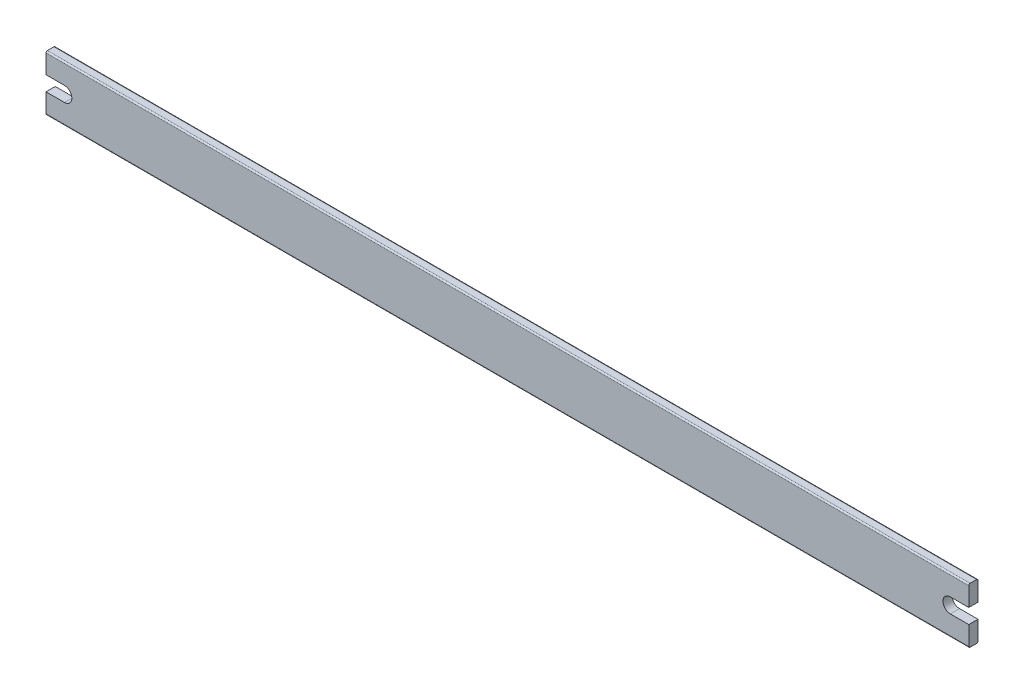
ISO-10303-21;
HEADER;
FILE_DESCRIPTION(('STEP AP214'),'2;1');
FILE_NAME('part.step','',(''),(''),'','','');
FILE_SCHEMA(('AUTOMOTIVE_DESIGN { 1 0 10303 214 1 1 1 1 }'));
ENDSEC;
DATA;
#1=APPLICATION_CONTEXT('core data for automotive mechanical design processes');
#2=APPLICATION_PROTOCOL_DEFINITION('international standard','automotive_design',2000,#1);
#3=PRODUCT_CONTEXT('',#1,'mechanical');
#4=PRODUCT('Part','Part','',(#3));
#5=PRODUCT_RELATED_PRODUCT_CATEGORY('part','',(#4));
#6=PRODUCT_DEFINITION_FORMATION('','',#4);
#7=PRODUCT_DEFINITION_CONTEXT('part definition',#1,'design');
#8=PRODUCT_DEFINITION('design','',#6,#7);
#9=PRODUCT_DEFINITION_SHAPE('','',#8);
#10=(LENGTH_UNIT() NAMED_UNIT(*) SI_UNIT(.MILLI.,.METRE.));
#11=(NAMED_UNIT(*) PLANE_ANGLE_UNIT() SI_UNIT($,.RADIAN.));
#12=(NAMED_UNIT(*) SI_UNIT($,.STERADIAN.) SOLID_ANGLE_UNIT());
#13=UNCERTAINTY_MEASURE_WITH_UNIT(LENGTH_MEASURE(1.E-05),#10,'distance_accuracy_value','');
#14=(GEOMETRIC_REPRESENTATION_CONTEXT(3) GLOBAL_UNCERTAINTY_ASSIGNED_CONTEXT((#13)) GLOBAL_UNIT_ASSIGNED_CONTEXT((#10,
#11,#12)) REPRESENTATION_CONTEXT('',''));
#15=CARTESIAN_POINT('',(0.,0.,0.));
#16=DIRECTION('',(0.,0.,1.));
#17=DIRECTION('',(1.,0.,0.));
#18=AXIS2_PLACEMENT_3D('',#15,#16,#17);
#19=CARTESIAN_POINT('',(250.,4.,2.5));
#20=DIRECTION('',(-1.,0.,0.));
#21=DIRECTION('',(0.,0.,1.));
#22=AXIS2_PLACEMENT_3D('',#19,#20,#21);
#23=PLANE('',#22);
#24=DIRECTION('',(0.,1.,0.));
#25=VECTOR('',#24,1.);
#26=CARTESIAN_POINT('',(250.,4.,-2.5));
#27=LINE('',#26,#25);
#28=CARTESIAN_POINT('',(250.,4.,-2.5));
#29=VERTEX_POINT('',#28);
#30=CARTESIAN_POINT('',(250.,14.25,-2.5));
#31=VERTEX_POINT('',#30);
#32=EDGE_CURVE('E196',#29,#31,#27,.T.);
#33=ORIENTED_EDGE('',*,*,#32,.T.);
#34=CARTESIAN_POINT('',(250.,14.25,-1.75));
#35=DIRECTION('',(-1.,0.,0.));
#36=DIRECTION('',(0.,0.,1.));
#37=AXIS2_PLACEMENT_3D('',#34,#35,#36);
#38=CIRCLE('',#37,0.75);
#39=CARTESIAN_POINT('',(250.,15.,-1.75));
#40=VERTEX_POINT('',#39);
#41=EDGE_CURVE('E11',#31,#40,#38,.F.);
#42=ORIENTED_EDGE('',*,*,#41,.T.);
#43=DIRECTION('',(0.,0.,-1.));
#44=VECTOR('',#43,1.);
#45=CARTESIAN_POINT('',(250.,15.,2.5));
#46=LINE('',#45,#44);
#47=CARTESIAN_POINT('',(250.,15.,1.75));
#48=VERTEX_POINT('',#47);
#49=EDGE_CURVE('E241',#48,#40,#46,.T.);
#50=ORIENTED_EDGE('',*,*,#49,.F.);
#51=CARTESIAN_POINT('',(250.,14.25,1.75));
#52=DIRECTION('',(-1.,0.,0.));
#53=DIRECTION('',(0.,0.,1.));
#54=AXIS2_PLACEMENT_3D('',#51,#52,#53);
#55=CIRCLE('',#54,0.75);
#56=CARTESIAN_POINT('',(250.,14.25,2.5));
#57=VERTEX_POINT('',#56);
#58=EDGE_CURVE('E46',#48,#57,#55,.F.);
#59=ORIENTED_EDGE('',*,*,#58,.T.);
#60=DIRECTION('',(0.,1.,0.));
#61=VECTOR('',#60,1.);
#62=CARTESIAN_POINT('',(250.,4.,2.5));
#63=LINE('',#62,#61);
#64=CARTESIAN_POINT('',(250.,4.,2.5));
#65=VERTEX_POINT('',#64);
#66=EDGE_CURVE('E162',#65,#57,#63,.T.);
#67=ORIENTED_EDGE('',*,*,#66,.F.);
#68=DIRECTION('',(0.,0.,-1.));
#69=VECTOR('',#68,1.);
#70=CARTESIAN_POINT('',(250.,4.,2.5));
#71=LINE('',#70,#69);
#72=EDGE_CURVE('E195',#65,#29,#71,.T.);
#73=ORIENTED_EDGE('',*,*,#72,.T.);
#74=EDGE_LOOP('',(#33,#42,#50,#59,#67,#73));
#75=FACE_BOUND('',#74,.T.);
#76=ADVANCED_FACE('F38',(#75),#23,.F.);
#77=CARTESIAN_POINT('',(-250.,15.,2.5));
#78=DIRECTION('',(0.,-1.,0.));
#79=DIRECTION('',(0.,0.,-1.));
#80=AXIS2_PLACEMENT_3D('',#77,#78,#79);
#81=PLANE('',#80);
#82=ORIENTED_EDGE('',*,*,#49,.T.);
#83=DIRECTION('',(-1.,0.,0.));
#84=VECTOR('',#83,1.);
#85=CARTESIAN_POINT('',(-250.,15.,-1.75));
#86=LINE('',#85,#84);
#87=CARTESIAN_POINT('',(-250.,15.,-1.75));
#88=VERTEX_POINT('',#87);
#89=EDGE_CURVE('E265',#40,#88,#86,.T.);
#90=ORIENTED_EDGE('',*,*,#89,.T.);
#91=DIRECTION('',(0.,0.,-1.));
#92=VECTOR('',#91,1.);
#93=CARTESIAN_POINT('',(-250.,15.,2.5));
#94=LINE('',#93,#92);
#95=CARTESIAN_POINT('',(-250.,15.,1.75));
#96=VERTEX_POINT('',#95);
#97=EDGE_CURVE('E172',#96,#88,#94,.T.);
#98=ORIENTED_EDGE('',*,*,#97,.F.);
#99=DIRECTION('',(-1.,0.,0.));
#100=VECTOR('',#99,1.);
#101=CARTESIAN_POINT('',(250.,15.,1.75));
#102=LINE('',#101,#100);
#103=EDGE_CURVE('E58',#96,#48,#102,.F.);
#104=ORIENTED_EDGE('',*,*,#103,.T.);
#105=EDGE_LOOP('',(#82,#90,#98,#104));
#106=FACE_BOUND('',#105,.T.);
#107=ADVANCED_FACE('F276',(#106),#81,.F.);
#108=CARTESIAN_POINT('',(-250.,4.,2.5));
#109=DIRECTION('',(1.,0.,0.));
#110=DIRECTION('',(0.,0.,-1.));
#111=AXIS2_PLACEMENT_3D('',#108,#109,#110);
#112=PLANE('',#111);
#113=ORIENTED_EDGE('',*,*,#97,.T.);
#114=CARTESIAN_POINT('',(-250.,14.25,-1.75));
#115=DIRECTION('',(1.,0.,0.));
#116=DIRECTION('',(0.,0.,-1.));
#117=AXIS2_PLACEMENT_3D('',#114,#115,#116);
#118=CIRCLE('',#117,0.75);
#119=CARTESIAN_POINT('',(-250.,14.25,-2.5));
#120=VERTEX_POINT('',#119);
#121=EDGE_CURVE('E270',#88,#120,#118,.F.);
#122=ORIENTED_EDGE('',*,*,#121,.T.);
#123=DIRECTION('',(0.,-1.,0.));
#124=VECTOR('',#123,1.);
#125=CARTESIAN_POINT('',(-250.,4.,-2.5));
#126=LINE('',#125,#124);
#127=CARTESIAN_POINT('',(-250.,4.,-2.5));
#128=VERTEX_POINT('',#127);
#129=EDGE_CURVE('E169',#120,#128,#126,.T.);
#130=ORIENTED_EDGE('',*,*,#129,.T.);
#131=DIRECTION('',(0.,0.,-1.));
#132=VECTOR('',#131,1.);
#133=CARTESIAN_POINT('',(-250.,4.,2.5));
#134=LINE('',#133,#132);
#135=CARTESIAN_POINT('',(-250.,4.,2.5));
#136=VERTEX_POINT('',#135);
#137=EDGE_CURVE('E165',#136,#128,#134,.T.);
#138=ORIENTED_EDGE('',*,*,#137,.F.);
#139=DIRECTION('',(0.,-1.,0.));
#140=VECTOR('',#139,1.);
#141=CARTESIAN_POINT('',(-250.,4.,2.5));
#142=LINE('',#141,#140);
#143=CARTESIAN_POINT('',(-250.,14.25,2.5));
#144=VERTEX_POINT('',#143);
#145=EDGE_CURVE('E151',#144,#136,#142,.T.);
#146=ORIENTED_EDGE('',*,*,#145,.F.);
#147=CARTESIAN_POINT('',(-250.,14.25,1.75));
#148=DIRECTION('',(1.,0.,0.));
#149=DIRECTION('',(0.,0.,-1.));
#150=AXIS2_PLACEMENT_3D('',#147,#148,#149);
#151=CIRCLE('',#150,0.75);
#152=EDGE_CURVE('E268',#144,#96,#151,.F.);
#153=ORIENTED_EDGE('',*,*,#152,.T.);
#154=EDGE_LOOP('',(#113,#122,#130,#138,#146,#153));
#155=FACE_BOUND('',#154,.T.);
#156=ADVANCED_FACE('F167',(#155),#112,.F.);
#157=CARTESIAN_POINT('',(-250.,4.,2.5));
#158=DIRECTION('',(0.,1.,0.));
#159=DIRECTION('',(0.,0.,1.));
#160=AXIS2_PLACEMENT_3D('',#157,#158,#159);
#161=PLANE('',#160);
#162=DIRECTION('',(1.,0.,0.));
#163=VECTOR('',#162,1.);
#164=CARTESIAN_POINT('',(-250.,4.,-2.5));
#165=LINE('',#164,#163);
#166=CARTESIAN_POINT('',(-240.,4.,-2.5));
#167=VERTEX_POINT('',#166);
#168=EDGE_CURVE('E199',#128,#167,#165,.T.);
#169=ORIENTED_EDGE('',*,*,#168,.T.);
#170=DIRECTION('',(0.,0.,-1.));
#171=VECTOR('',#170,1.);
#172=CARTESIAN_POINT('',(-240.,4.,2.5));
#173=LINE('',#172,#171);
#174=CARTESIAN_POINT('',(-240.,4.,2.5));
#175=VERTEX_POINT('',#174);
#176=EDGE_CURVE('E173',#175,#167,#173,.T.);
#177=ORIENTED_EDGE('',*,*,#176,.F.);
#178=DIRECTION('',(1.,0.,0.));
#179=VECTOR('',#178,1.);
#180=CARTESIAN_POINT('',(-250.,4.,2.5));
#181=LINE('',#180,#179);
#182=EDGE_CURVE('E156',#136,#175,#181,.T.);
#183=ORIENTED_EDGE('',*,*,#182,.F.);
#184=ORIENTED_EDGE('',*,*,#137,.T.);
#185=EDGE_LOOP('',(#169,#177,#183,#184));
#186=FACE_BOUND('',#185,.T.);
#187=ADVANCED_FACE('F175',(#186),#161,.F.);
#188=CARTESIAN_POINT('',(-240.,0.,2.5));
#189=DIRECTION('',(0.,0.,-1.));
#190=DIRECTION('',(-1.,0.,0.));
#191=AXIS2_PLACEMENT_3D('',#188,#189,#190);
#192=CYLINDRICAL_SURFACE('',#191,4.);
#193=CARTESIAN_POINT('',(-240.,0.,-2.5));
#194=DIRECTION('',(0.,0.,-1.));
#195=DIRECTION('',(1.,0.,0.));
#196=AXIS2_PLACEMENT_3D('',#193,#194,#195);
#197=CIRCLE('',#196,4.);
#198=CARTESIAN_POINT('',(-240.,-4.,-2.5));
#199=VERTEX_POINT('',#198);
#200=EDGE_CURVE('E201',#167,#199,#197,.T.);
#201=ORIENTED_EDGE('',*,*,#200,.T.);
#202=DIRECTION('',(0.,0.,-1.));
#203=VECTOR('',#202,1.);
#204=CARTESIAN_POINT('',(-240.,-4.,2.5));
#205=LINE('',#204,#203);
#206=CARTESIAN_POINT('',(-240.,-4.,2.5));
#207=VERTEX_POINT('',#206);
#208=EDGE_CURVE('E236',#207,#199,#205,.T.);
#209=ORIENTED_EDGE('',*,*,#208,.F.);
#210=CARTESIAN_POINT('',(-240.,0.,2.5));
#211=DIRECTION('',(0.,0.,-1.));
#212=DIRECTION('',(1.,0.,0.));
#213=AXIS2_PLACEMENT_3D('',#210,#211,#212);
#214=CIRCLE('',#213,4.);
#215=EDGE_CURVE('E178',#175,#207,#214,.T.);
#216=ORIENTED_EDGE('',*,*,#215,.F.);
#217=ORIENTED_EDGE('',*,*,#176,.T.);
#218=EDGE_LOOP('',(#201,#209,#216,#217));
#219=FACE_BOUND('',#218,.T.);
#220=ADVANCED_FACE('F288',(#219),#192,.F.);
#221=CARTESIAN_POINT('',(-250.,-4.,2.5));
#222=DIRECTION('',(0.,-1.,0.));
#223=DIRECTION('',(1.,0.,0.));
#224=AXIS2_PLACEMENT_3D('',#221,#222,#223);
#225=PLANE('',#224);
#226=DIRECTION('',(-1.,0.,0.));
#227=VECTOR('',#226,1.);
#228=CARTESIAN_POINT('',(-250.,-4.,-2.5));
#229=LINE('',#228,#227);
#230=CARTESIAN_POINT('',(-250.,-4.,-2.5));
#231=VERTEX_POINT('',#230);
#232=EDGE_CURVE('E203',#199,#231,#229,.T.);
#233=ORIENTED_EDGE('',*,*,#232,.T.);
#234=DIRECTION('',(0.,0.,-1.));
#235=VECTOR('',#234,1.);
#236=CARTESIAN_POINT('',(-250.,-4.,2.5));
#237=LINE('',#236,#235);
#238=CARTESIAN_POINT('',(-250.,-4.,2.5));
#239=VERTEX_POINT('',#238);
#240=EDGE_CURVE('E233',#239,#231,#237,.T.);
#241=ORIENTED_EDGE('',*,*,#240,.F.);
#242=DIRECTION('',(-1.,0.,0.));
#243=VECTOR('',#242,1.);
#244=CARTESIAN_POINT('',(-250.,-4.,2.5));
#245=LINE('',#244,#243);
#246=EDGE_CURVE('E180',#207,#239,#245,.T.);
#247=ORIENTED_EDGE('',*,*,#246,.F.);
#248=ORIENTED_EDGE('',*,*,#208,.T.);
#249=EDGE_LOOP('',(#233,#241,#247,#248));
#250=FACE_BOUND('',#249,.T.);
#251=ADVANCED_FACE('F295',(#250),#225,.F.);
#252=CARTESIAN_POINT('',(-250.,-15.,2.5));
#253=DIRECTION('',(1.,0.,0.));
#254=DIRECTION('',(0.,0.,-1.));
#255=AXIS2_PLACEMENT_3D('',#252,#253,#254);
#256=PLANE('',#255);
#257=DIRECTION('',(0.,-1.,0.));
#258=VECTOR('',#257,1.);
#259=CARTESIAN_POINT('',(-250.,-15.,-2.5));
#260=LINE('',#259,#258);
#261=CARTESIAN_POINT('',(-250.,-14.25,-2.5));
#262=VERTEX_POINT('',#261);
#263=EDGE_CURVE('E205',#231,#262,#260,.T.);
#264=ORIENTED_EDGE('',*,*,#263,.T.);
#265=CARTESIAN_POINT('',(-250.,-14.25,-1.75));
#266=DIRECTION('',(1.,0.,0.));
#267=DIRECTION('',(0.,0.,-1.));
#268=AXIS2_PLACEMENT_3D('',#265,#266,#267);
#269=CIRCLE('',#268,0.75);
#270=CARTESIAN_POINT('',(-250.,-15.,-1.75));
#271=VERTEX_POINT('',#270);
#272=EDGE_CURVE('E258',#262,#271,#269,.F.);
#273=ORIENTED_EDGE('',*,*,#272,.T.);
#274=DIRECTION('',(0.,0.,-1.));
#275=VECTOR('',#274,1.);
#276=CARTESIAN_POINT('',(-250.,-15.,2.5));
#277=LINE('',#276,#275);
#278=CARTESIAN_POINT('',(-250.,-15.,1.75));
#279=VERTEX_POINT('',#278);
#280=EDGE_CURVE('E230',#279,#271,#277,.T.);
#281=ORIENTED_EDGE('',*,*,#280,.F.);
#282=CARTESIAN_POINT('',(-250.,-14.25,1.75));
#283=DIRECTION('',(1.,0.,0.));
#284=DIRECTION('',(0.,0.,-1.));
#285=AXIS2_PLACEMENT_3D('',#282,#283,#284);
#286=CIRCLE('',#285,0.75);
#287=CARTESIAN_POINT('',(-250.,-14.25,2.5));
#288=VERTEX_POINT('',#287);
#289=EDGE_CURVE('E256',#279,#288,#286,.F.);
#290=ORIENTED_EDGE('',*,*,#289,.T.);
#291=DIRECTION('',(0.,-1.,0.));
#292=VECTOR('',#291,1.);
#293=CARTESIAN_POINT('',(-250.,-15.,2.5));
#294=LINE('',#293,#292);
#295=EDGE_CURVE('E185',#239,#288,#294,.T.);
#296=ORIENTED_EDGE('',*,*,#295,.F.);
#297=ORIENTED_EDGE('',*,*,#240,.T.);
#298=EDGE_LOOP('',(#264,#273,#281,#290,#296,#297));
#299=FACE_BOUND('',#298,.T.);
#300=ADVANCED_FACE('F298',(#299),#256,.F.);
#301=CARTESIAN_POINT('',(-250.,-15.,2.5));
#302=DIRECTION('',(0.,1.,0.));
#303=DIRECTION('',(0.,0.,1.));
#304=AXIS2_PLACEMENT_3D('',#301,#302,#303);
#305=PLANE('',#304);
#306=ORIENTED_EDGE('',*,*,#280,.T.);
#307=DIRECTION('',(1.,0.,0.));
#308=VECTOR('',#307,1.);
#309=CARTESIAN_POINT('',(-250.,-15.,-1.75));
#310=LINE('',#309,#308);
#311=CARTESIAN_POINT('',(250.,-15.,-1.75));
#312=VERTEX_POINT('',#311);
#313=EDGE_CURVE('E245',#271,#312,#310,.T.);
#314=ORIENTED_EDGE('',*,*,#313,.T.);
#315=DIRECTION('',(0.,0.,-1.));
#316=VECTOR('',#315,1.);
#317=CARTESIAN_POINT('',(250.,-15.,2.5));
#318=LINE('',#317,#316);
#319=CARTESIAN_POINT('',(250.,-15.,1.75));
#320=VERTEX_POINT('',#319);
#321=EDGE_CURVE('E227',#320,#312,#318,.T.);
#322=ORIENTED_EDGE('',*,*,#321,.F.);
#323=DIRECTION('',(1.,0.,0.));
#324=VECTOR('',#323,1.);
#325=CARTESIAN_POINT('',(-250.,-15.,1.75));
#326=LINE('',#325,#324);
#327=EDGE_CURVE('E243',#320,#279,#326,.F.);
#328=ORIENTED_EDGE('',*,*,#327,.T.);
#329=EDGE_LOOP('',(#306,#314,#322,#328));
#330=FACE_BOUND('',#329,.T.);
#331=ADVANCED_FACE('F328',(#330),#305,.F.);
#332=CARTESIAN_POINT('',(250.,-15.,2.5));
#333=DIRECTION('',(-1.,0.,0.));
#334=DIRECTION('',(0.,0.,1.));
#335=AXIS2_PLACEMENT_3D('',#332,#333,#334);
#336=PLANE('',#335);
#337=ORIENTED_EDGE('',*,*,#321,.T.);
#338=CARTESIAN_POINT('',(250.,-14.25,-1.75));
#339=DIRECTION('',(-1.,0.,0.));
#340=DIRECTION('',(0.,0.,1.));
#341=AXIS2_PLACEMENT_3D('',#338,#339,#340);
#342=CIRCLE('',#341,0.75);
#343=CARTESIAN_POINT('',(250.,-14.25,-2.5));
#344=VERTEX_POINT('',#343);
#345=EDGE_CURVE('E250',#312,#344,#342,.F.);
#346=ORIENTED_EDGE('',*,*,#345,.T.);
#347=DIRECTION('',(0.,1.,0.));
#348=VECTOR('',#347,1.);
#349=CARTESIAN_POINT('',(250.,-15.,-2.5));
#350=LINE('',#349,#348);
#351=CARTESIAN_POINT('',(250.,-4.,-2.5));
#352=VERTEX_POINT('',#351);
#353=EDGE_CURVE('E208',#344,#352,#350,.T.);
#354=ORIENTED_EDGE('',*,*,#353,.T.);
#355=DIRECTION('',(0.,0.,-1.));
#356=VECTOR('',#355,1.);
#357=CARTESIAN_POINT('',(250.,-4.,2.5));
#358=LINE('',#357,#356);
#359=CARTESIAN_POINT('',(250.,-4.,2.5));
#360=VERTEX_POINT('',#359);
#361=EDGE_CURVE('E224',#360,#352,#358,.T.);
#362=ORIENTED_EDGE('',*,*,#361,.F.);
#363=DIRECTION('',(0.,1.,0.));
#364=VECTOR('',#363,1.);
#365=CARTESIAN_POINT('',(250.,-15.,2.5));
#366=LINE('',#365,#364);
#367=CARTESIAN_POINT('',(250.,-14.25,2.5));
#368=VERTEX_POINT('',#367);
#369=EDGE_CURVE('E187',#368,#360,#366,.T.);
#370=ORIENTED_EDGE('',*,*,#369,.F.);
#371=CARTESIAN_POINT('',(250.,-14.25,1.75));
#372=DIRECTION('',(-1.,0.,0.));
#373=DIRECTION('',(0.,0.,1.));
#374=AXIS2_PLACEMENT_3D('',#371,#372,#373);
#375=CIRCLE('',#374,0.75);
#376=EDGE_CURVE('E248',#368,#320,#375,.F.);
#377=ORIENTED_EDGE('',*,*,#376,.T.);
#378=EDGE_LOOP('',(#337,#346,#354,#362,#370,#377));
#379=FACE_BOUND('',#378,.T.);
#380=ADVANCED_FACE('F307',(#379),#336,.F.);
#381=CARTESIAN_POINT('',(250.,-4.,2.5));
#382=DIRECTION('',(0.,-1.,0.));
#383=DIRECTION('',(1.,0.,0.));
#384=AXIS2_PLACEMENT_3D('',#381,#382,#383);
#385=PLANE('',#384);
#386=DIRECTION('',(-1.,0.,0.));
#387=VECTOR('',#386,1.);
#388=CARTESIAN_POINT('',(250.,-4.,-2.5));
#389=LINE('',#388,#387);
#390=CARTESIAN_POINT('',(239.999999106669,-4.,-2.5));
#391=VERTEX_POINT('',#390);
#392=EDGE_CURVE('E210',#352,#391,#389,.T.);
#393=ORIENTED_EDGE('',*,*,#392,.T.);
#394=DIRECTION('',(0.,0.,-1.));
#395=VECTOR('',#394,1.);
#396=CARTESIAN_POINT('',(239.999999106669,-4.,2.5));
#397=LINE('',#396,#395);
#398=CARTESIAN_POINT('',(239.999999106669,-4.,2.5));
#399=VERTEX_POINT('',#398);
#400=EDGE_CURVE('E221',#399,#391,#397,.T.);
#401=ORIENTED_EDGE('',*,*,#400,.F.);
#402=DIRECTION('',(-1.,0.,0.));
#403=VECTOR('',#402,1.);
#404=CARTESIAN_POINT('',(250.,-4.,2.5));
#405=LINE('',#404,#403);
#406=EDGE_CURVE('E189',#360,#399,#405,.T.);
#407=ORIENTED_EDGE('',*,*,#406,.F.);
#408=ORIENTED_EDGE('',*,*,#361,.T.);
#409=EDGE_LOOP('',(#393,#401,#407,#408));
#410=FACE_BOUND('',#409,.T.);
#411=ADVANCED_FACE('F313',(#410),#385,.F.);
#412=CARTESIAN_POINT('',(239.999999106669,0.,2.5));
#413=DIRECTION('',(0.,0.,-1.));
#414=DIRECTION('',(-1.,0.,0.));
#415=AXIS2_PLACEMENT_3D('',#412,#413,#414);
#416=CYLINDRICAL_SURFACE('',#415,4.00000000000005);
#417=CARTESIAN_POINT('',(239.999999106669,0.,-2.5));
#418=DIRECTION('',(0.,0.,-1.));
#419=DIRECTION('',(1.,0.,0.));
#420=AXIS2_PLACEMENT_3D('',#417,#418,#419);
#421=CIRCLE('',#420,4.00000000000005);
#422=CARTESIAN_POINT('',(240.,3.99999999999995,-2.5));
#423=VERTEX_POINT('',#422);
#424=EDGE_CURVE('E212',#391,#423,#421,.T.);
#425=ORIENTED_EDGE('',*,*,#424,.T.);
#426=DIRECTION('',(0.,0.,-1.));
#427=VECTOR('',#426,1.);
#428=CARTESIAN_POINT('',(240.,3.99999999999995,2.5));
#429=LINE('',#428,#427);
#430=CARTESIAN_POINT('',(240.,3.99999999999995,2.5));
#431=VERTEX_POINT('',#430);
#432=EDGE_CURVE('E218',#431,#423,#429,.T.);
#433=ORIENTED_EDGE('',*,*,#432,.F.);
#434=CARTESIAN_POINT('',(239.999999106669,0.,2.5));
#435=DIRECTION('',(0.,0.,-1.));
#436=DIRECTION('',(1.,0.,0.));
#437=AXIS2_PLACEMENT_3D('',#434,#435,#436);
#438=CIRCLE('',#437,4.00000000000005);
#439=EDGE_CURVE('E191',#399,#431,#438,.T.);
#440=ORIENTED_EDGE('',*,*,#439,.F.);
#441=ORIENTED_EDGE('',*,*,#400,.T.);
#442=EDGE_LOOP('',(#425,#433,#440,#441));
#443=FACE_BOUND('',#442,.T.);
#444=ADVANCED_FACE('F317',(#443),#416,.F.);
#445=CARTESIAN_POINT('',(250.,4.,2.5));
#446=DIRECTION('',(0.,1.,0.));
#447=DIRECTION('',(0.,0.,1.));
#448=AXIS2_PLACEMENT_3D('',#445,#446,#447);
#449=PLANE('',#448);
#450=DIRECTION('',(1.,0.,0.));
#451=VECTOR('',#450,1.);
#452=CARTESIAN_POINT('',(250.,4.,-2.5));
#453=LINE('',#452,#451);
#454=EDGE_CURVE('E214',#423,#29,#453,.T.);
#455=ORIENTED_EDGE('',*,*,#454,.T.);
#456=ORIENTED_EDGE('',*,*,#72,.F.);
#457=DIRECTION('',(1.,0.,0.));
#458=VECTOR('',#457,1.);
#459=CARTESIAN_POINT('',(250.,4.,2.5));
#460=LINE('',#459,#458);
#461=EDGE_CURVE('E193',#431,#65,#460,.T.);
#462=ORIENTED_EDGE('',*,*,#461,.F.);
#463=ORIENTED_EDGE('',*,*,#432,.T.);
#464=EDGE_LOOP('',(#455,#456,#462,#463));
#465=FACE_BOUND('',#464,.T.);
#466=ADVANCED_FACE('F321',(#465),#449,.F.);
#467=CARTESIAN_POINT('',(-240.,0.,2.5));
#468=DIRECTION('',(0.,0.,1.));
#469=DIRECTION('',(1.,0.,0.));
#470=AXIS2_PLACEMENT_3D('',#467,#468,#469);
#471=PLANE('',#470);
#472=ORIENTED_EDGE('',*,*,#295,.T.);
#473=DIRECTION('',(1.,0.,0.));
#474=VECTOR('',#473,1.);
#475=CARTESIAN_POINT('',(250.,-14.25,2.5));
#476=LINE('',#475,#474);
#477=EDGE_CURVE('E261',#288,#368,#476,.T.);
#478=ORIENTED_EDGE('',*,*,#477,.T.);
#479=ORIENTED_EDGE('',*,*,#369,.T.);
#480=ORIENTED_EDGE('',*,*,#406,.T.);
#481=ORIENTED_EDGE('',*,*,#439,.T.);
#482=ORIENTED_EDGE('',*,*,#461,.T.);
#483=ORIENTED_EDGE('',*,*,#66,.T.);
#484=DIRECTION('',(-1.,0.,0.));
#485=VECTOR('',#484,1.);
#486=CARTESIAN_POINT('',(-250.,14.25,2.5));
#487=LINE('',#486,#485);
#488=EDGE_CURVE('E160',#57,#144,#487,.T.);
#489=ORIENTED_EDGE('',*,*,#488,.T.);
#490=ORIENTED_EDGE('',*,*,#145,.T.);
#491=ORIENTED_EDGE('',*,*,#182,.T.);
#492=ORIENTED_EDGE('',*,*,#215,.T.);
#493=ORIENTED_EDGE('',*,*,#246,.T.);
#494=EDGE_LOOP('',(#472,#478,#479,#480,#481,#482,#483,#489,#490,#491,#492,#493));
#495=FACE_BOUND('',#494,.T.);
#496=ADVANCED_FACE('F154',(#495),#471,.T.);
#497=CARTESIAN_POINT('',(-240.,0.,-2.5));
#498=DIRECTION('',(0.,0.,1.));
#499=DIRECTION('',(1.,0.,0.));
#500=AXIS2_PLACEMENT_3D('',#497,#498,#499);
#501=PLANE('',#500);
#502=ORIENTED_EDGE('',*,*,#353,.F.);
#503=DIRECTION('',(1.,0.,0.));
#504=VECTOR('',#503,1.);
#505=CARTESIAN_POINT('',(-240.,-14.25,-2.5));
#506=LINE('',#505,#504);
#507=EDGE_CURVE('E254',#344,#262,#506,.F.);
#508=ORIENTED_EDGE('',*,*,#507,.T.);
#509=ORIENTED_EDGE('',*,*,#263,.F.);
#510=ORIENTED_EDGE('',*,*,#232,.F.);
#511=ORIENTED_EDGE('',*,*,#200,.F.);
#512=ORIENTED_EDGE('',*,*,#168,.F.);
#513=ORIENTED_EDGE('',*,*,#129,.F.);
#514=DIRECTION('',(-1.,0.,0.));
#515=VECTOR('',#514,1.);
#516=CARTESIAN_POINT('',(-240.,14.25,-2.5));
#517=LINE('',#516,#515);
#518=EDGE_CURVE('E252',#120,#31,#517,.F.);
#519=ORIENTED_EDGE('',*,*,#518,.T.);
#520=ORIENTED_EDGE('',*,*,#32,.F.);
#521=ORIENTED_EDGE('',*,*,#454,.F.);
#522=ORIENTED_EDGE('',*,*,#424,.F.);
#523=ORIENTED_EDGE('',*,*,#392,.F.);
#524=EDGE_LOOP('',(#502,#508,#509,#510,#511,#512,#513,#519,#520,#521,#522,#523));
#525=FACE_BOUND('',#524,.T.);
#526=ADVANCED_FACE('F283',(#525),#501,.F.);
#527=CARTESIAN_POINT('',(-250.,-14.25,-1.75));
#528=DIRECTION('',(1.,0.,0.));
#529=DIRECTION('',(0.,0.,-1.));
#530=AXIS2_PLACEMENT_3D('',#527,#528,#529);
#531=CYLINDRICAL_SURFACE('',#530,0.75);
#532=ORIENTED_EDGE('',*,*,#272,.F.);
#533=ORIENTED_EDGE('',*,*,#507,.F.);
#534=ORIENTED_EDGE('',*,*,#345,.F.);
#535=ORIENTED_EDGE('',*,*,#313,.F.);
#536=EDGE_LOOP('',(#532,#533,#534,#535));
#537=FACE_BOUND('',#536,.T.);
#538=ADVANCED_FACE('F325',(#537),#531,.T.);
#539=CARTESIAN_POINT('',(-240.,-14.25,1.75));
#540=DIRECTION('',(-1.,0.,0.));
#541=DIRECTION('',(0.,0.,1.));
#542=AXIS2_PLACEMENT_3D('',#539,#540,#541);
#543=CYLINDRICAL_SURFACE('',#542,0.75);
#544=ORIENTED_EDGE('',*,*,#289,.F.);
#545=ORIENTED_EDGE('',*,*,#327,.F.);
#546=ORIENTED_EDGE('',*,*,#376,.F.);
#547=ORIENTED_EDGE('',*,*,#477,.F.);
#548=EDGE_LOOP('',(#544,#545,#546,#547));
#549=FACE_BOUND('',#548,.T.);
#550=ADVANCED_FACE('F303',(#549),#543,.T.);
#551=CARTESIAN_POINT('',(-250.,14.25,-1.75));
#552=DIRECTION('',(-1.,0.,0.));
#553=DIRECTION('',(0.,0.,1.));
#554=AXIS2_PLACEMENT_3D('',#551,#552,#553);
#555=CYLINDRICAL_SURFACE('',#554,0.75);
#556=ORIENTED_EDGE('',*,*,#41,.F.);
#557=ORIENTED_EDGE('',*,*,#518,.F.);
#558=ORIENTED_EDGE('',*,*,#121,.F.);
#559=ORIENTED_EDGE('',*,*,#89,.F.);
#560=EDGE_LOOP('',(#556,#557,#558,#559));
#561=FACE_BOUND('',#560,.T.);
#562=ADVANCED_FACE('F279',(#561),#555,.T.);
#563=CARTESIAN_POINT('',(-240.,14.25,1.75));
#564=DIRECTION('',(1.,0.,0.));
#565=DIRECTION('',(0.,0.,-1.));
#566=AXIS2_PLACEMENT_3D('',#563,#564,#565);
#567=CYLINDRICAL_SURFACE('',#566,0.75);
#568=ORIENTED_EDGE('',*,*,#58,.F.);
#569=ORIENTED_EDGE('',*,*,#103,.F.);
#570=ORIENTED_EDGE('',*,*,#152,.F.);
#571=ORIENTED_EDGE('',*,*,#488,.F.);
#572=EDGE_LOOP('',(#568,#569,#570,#571));
#573=FACE_BOUND('',#572,.T.);
#574=ADVANCED_FACE('F40',(#573),#567,.T.);
#575=CLOSED_SHELL('',(#76,#107,#156,#187,#220,#251,#300,#331,#380,#411,#444,#466,#496,#526,#538,
#550,#562,#574));
#576=MANIFOLD_SOLID_BREP('B2',#575);
#577=ADVANCED_BREP_SHAPE_REPRESENTATION('',(#18,#576),#14);
#578=SHAPE_DEFINITION_REPRESENTATION(#9,#577);
ENDSEC;
END-ISO-10303-21;
